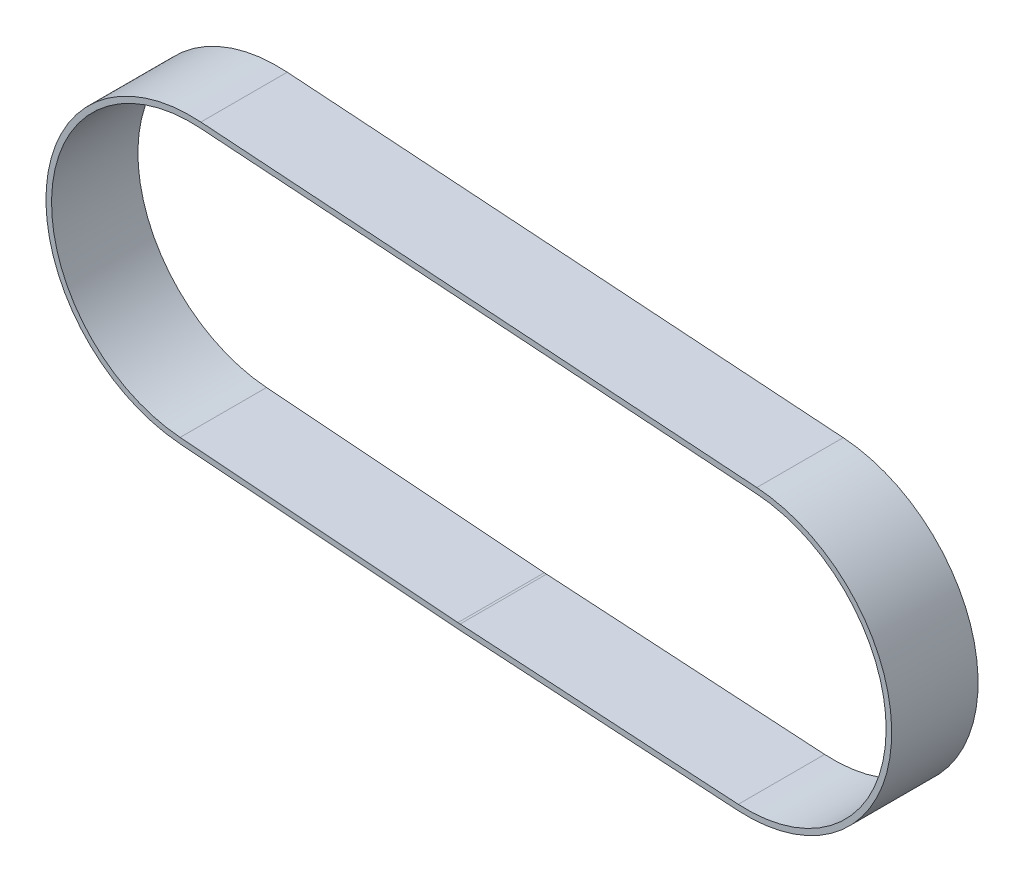
ISO-10303-21;
HEADER;
FILE_DESCRIPTION(('STEP AP214'),'2;1');
FILE_NAME('part.step','',(''),(''),'','','');
FILE_SCHEMA(('AUTOMOTIVE_DESIGN { 1 0 10303 214 1 1 1 1 }'));
ENDSEC;
DATA;
#1=APPLICATION_CONTEXT('core data for automotive mechanical design processes');
#2=APPLICATION_PROTOCOL_DEFINITION('international standard','automotive_design',2000,#1);
#3=PRODUCT_CONTEXT('',#1,'mechanical');
#4=PRODUCT('Part','Part','',(#3));
#5=PRODUCT_RELATED_PRODUCT_CATEGORY('part','',(#4));
#6=PRODUCT_DEFINITION_FORMATION('','',#4);
#7=PRODUCT_DEFINITION_CONTEXT('part definition',#1,'design');
#8=PRODUCT_DEFINITION('design','',#6,#7);
#9=PRODUCT_DEFINITION_SHAPE('','',#8);
#10=(LENGTH_UNIT() NAMED_UNIT(*) SI_UNIT(.MILLI.,.METRE.));
#11=(NAMED_UNIT(*) PLANE_ANGLE_UNIT() SI_UNIT($,.RADIAN.));
#12=(NAMED_UNIT(*) SI_UNIT($,.STERADIAN.) SOLID_ANGLE_UNIT());
#13=UNCERTAINTY_MEASURE_WITH_UNIT(LENGTH_MEASURE(1.E-05),#10,'distance_accuracy_value','');
#14=(GEOMETRIC_REPRESENTATION_CONTEXT(3) GLOBAL_UNCERTAINTY_ASSIGNED_CONTEXT((#13)) GLOBAL_UNIT_ASSIGNED_CONTEXT((#10,
#11,#12)) REPRESENTATION_CONTEXT('',''));
#15=CARTESIAN_POINT('',(0.,0.,0.));
#16=DIRECTION('',(0.,0.,1.));
#17=DIRECTION('',(1.,0.,0.));
#18=AXIS2_PLACEMENT_3D('',#15,#16,#17);
#19=CARTESIAN_POINT('',(0.040774318462956,0.547539602275451,1.));
#20=DIRECTION('',(0.,0.,1.));
#21=DIRECTION('',(1.,0.,0.));
#22=AXIS2_PLACEMENT_3D('',#19,#20,#21);
#23=PLANE('',#22);
#24=CARTESIAN_POINT('',(0.040774318462956,0.547539602275451,1.));
#25=DIRECTION('',(0.,0.,1.));
#26=DIRECTION('',(1.,0.,0.));
#27=AXIS2_PLACEMENT_3D('',#24,#25,#26);
#28=CIRCLE('',#27,52.);
#29=CARTESIAN_POINT('',(3.63482432062209,52.4231871122775,1.));
#30=VERTEX_POINT('',#29);
#31=CARTESIAN_POINT('',(-3.96322801868593,-51.2980770425684,1.));
#32=VERTEX_POINT('',#31);
#33=EDGE_CURVE('E205',#30,#32,#28,.T.);
#34=ORIENTED_EDGE('',*,*,#33,.T.);
#35=DIRECTION('',(0.99703108932392,-0.0770000449451709,0.));
#36=VECTOR('',#35,1.);
#37=CARTESIAN_POINT('',(-3.96322801868593,-51.2980770425684,1.));
#38=LINE('',#37,#36);
#39=CARTESIAN_POINT('',(95.7398809137061,-58.9980815370855,1.));
#40=VERTEX_POINT('',#39);
#41=EDGE_CURVE('E268',#32,#40,#38,.T.);
#42=ORIENTED_EDGE('',*,*,#41,.T.);
#43=CARTESIAN_POINT('',(99.743883250855,-7.15246489224164,1.));
#44=DIRECTION('',(0.,0.,1.));
#45=DIRECTION('',(1.,0.,0.));
#46=AXIS2_PLACEMENT_3D('',#43,#44,#45);
#47=CIRCLE('',#46,52.);
#48=CARTESIAN_POINT('',(96.5600101623259,-59.0549017536853,1.));
#49=VERTEX_POINT('',#48);
#50=EDGE_CURVE('E270',#40,#49,#47,.T.);
#51=ORIENTED_EDGE('',*,*,#50,.T.);
#52=DIRECTION('',(0.998123785796992,-0.0612283286255595,0.));
#53=VECTOR('',#52,1.);
#54=CARTESIAN_POINT('',(96.5600101623259,-59.0549017536853,1.));
#55=LINE('',#54,#53);
#56=CARTESIAN_POINT('',(196.372388742025,-65.1777346162412,1.));
#57=VERTEX_POINT('',#56);
#58=EDGE_CURVE('E272',#49,#57,#55,.T.);
#59=ORIENTED_EDGE('',*,*,#58,.T.);
#60=CARTESIAN_POINT('',(199.556261830554,-13.2752977547976,1.));
#61=DIRECTION('',(0.,0.,1.));
#62=DIRECTION('',(1.,0.,0.));
#63=AXIS2_PLACEMENT_3D('',#60,#61,#62);
#64=CIRCLE('',#63,52.);
#65=CARTESIAN_POINT('',(203.150311832713,38.6003497552045,1.));
#66=VERTEX_POINT('',#65);
#67=EDGE_CURVE('E274',#57,#66,#64,.T.);
#68=ORIENTED_EDGE('',*,*,#67,.T.);
#69=DIRECTION('',(-0.997608605961578,0.0691163461953677,0.));
#70=VECTOR('',#69,1.);
#71=CARTESIAN_POINT('',(203.150311832713,38.6003497552045,1.));
#72=LINE('',#71,#70);
#73=EDGE_CURVE('E128',#66,#30,#72,.T.);
#74=ORIENTED_EDGE('',*,*,#73,.T.);
#75=EDGE_LOOP('',(#34,#42,#51,#59,#68,#74));
#76=FACE_BOUND('',#75,.T.);
#77=DIRECTION('',(0.99703108932392,-0.0770000449451709,0.));
#78=VECTOR('',#77,1.);
#79=CARTESIAN_POINT('',(-3.80922792879559,-49.3040148639205,1.));
#80=LINE('',#79,#78);
#81=CARTESIAN_POINT('',(-3.80922792879559,-49.3040148639205,1.));
#82=VERTEX_POINT('',#81);
#83=CARTESIAN_POINT('',(95.8938810035964,-57.0040193584376,1.));
#84=VERTEX_POINT('',#83);
#85=EDGE_CURVE('E249',#82,#84,#80,.T.);
#86=ORIENTED_EDGE('',*,*,#85,.F.);
#87=CARTESIAN_POINT('',(0.040774318462956,0.547539602275451,1.));
#88=DIRECTION('',(0.,0.,1.));
#89=DIRECTION('',(1.,0.,0.));
#90=AXIS2_PLACEMENT_3D('',#87,#88,#89);
#91=CIRCLE('',#90,50.);
#92=CARTESIAN_POINT('',(3.49659162823134,50.4279699003543,1.));
#93=VERTEX_POINT('',#92);
#94=EDGE_CURVE('E202',#93,#82,#91,.T.);
#95=ORIENTED_EDGE('',*,*,#94,.F.);
#96=DIRECTION('',(-0.997608605961578,0.0691163461953676,0.));
#97=VECTOR('',#96,1.);
#98=CARTESIAN_POINT('',(203.012079140322,36.6051325432813,1.));
#99=LINE('',#98,#97);
#100=CARTESIAN_POINT('',(203.012079140322,36.6051325432813,1.));
#101=VERTEX_POINT('',#100);
#102=EDGE_CURVE('E257',#101,#93,#99,.T.);
#103=ORIENTED_EDGE('',*,*,#102,.F.);
#104=CARTESIAN_POINT('',(199.556261830554,-13.2752977547976,1.));
#105=DIRECTION('',(0.,0.,1.));
#106=DIRECTION('',(1.,0.,0.));
#107=AXIS2_PLACEMENT_3D('',#104,#105,#106);
#108=CIRCLE('',#107,50.);
#109=CARTESIAN_POINT('',(196.494845399276,-63.1814870446472,1.));
#110=VERTEX_POINT('',#109);
#111=EDGE_CURVE('E255',#110,#101,#108,.T.);
#112=ORIENTED_EDGE('',*,*,#111,.F.);
#113=DIRECTION('',(0.998123785796992,-0.0612283286255595,0.));
#114=VECTOR('',#113,1.);
#115=CARTESIAN_POINT('',(96.682466819577,-57.0586541820913,1.));
#116=LINE('',#115,#114);
#117=CARTESIAN_POINT('',(96.682466819577,-57.0586541820913,1.));
#118=VERTEX_POINT('',#117);
#119=EDGE_CURVE('E253',#118,#110,#116,.T.);
#120=ORIENTED_EDGE('',*,*,#119,.F.);
#121=CARTESIAN_POINT('',(99.743883250855,-7.15246489224164,1.));
#122=DIRECTION('',(0.,0.,1.));
#123=DIRECTION('',(1.,0.,0.));
#124=AXIS2_PLACEMENT_3D('',#121,#122,#123);
#125=CIRCLE('',#124,50.);
#126=EDGE_CURVE('E251',#84,#118,#125,.T.);
#127=ORIENTED_EDGE('',*,*,#126,.F.);
#128=EDGE_LOOP('',(#86,#95,#103,#112,#120,#127));
#129=FACE_BOUND('',#128,.T.);
#130=ADVANCED_FACE('F105',(#76,#129),#23,.T.);
#131=CARTESIAN_POINT('',(0.040774318462956,0.547539602275451,1.));
#132=DIRECTION('',(0.,0.,-1.));
#133=DIRECTION('',(-1.,0.,0.));
#134=AXIS2_PLACEMENT_3D('',#131,#132,#133);
#135=CYLINDRICAL_SURFACE('',#134,52.);
#136=DIRECTION('',(0.,0.,-1.));
#137=VECTOR('',#136,1.);
#138=CARTESIAN_POINT('',(3.63482432062209,52.4231871122775,1.));
#139=LINE('',#138,#137);
#140=CARTESIAN_POINT('',(3.63482432062209,52.4231871122775,-30.));
#141=VERTEX_POINT('',#140);
#142=EDGE_CURVE('E277',#30,#141,#139,.T.);
#143=ORIENTED_EDGE('',*,*,#142,.T.);
#144=CARTESIAN_POINT('',(0.040774318462956,0.547539602275451,-30.));
#145=DIRECTION('',(0.,0.,1.));
#146=DIRECTION('',(1.,0.,0.));
#147=AXIS2_PLACEMENT_3D('',#144,#145,#146);
#148=CIRCLE('',#147,52.);
#149=CARTESIAN_POINT('',(-3.96322801868593,-51.2980770425684,-30.));
#150=VERTEX_POINT('',#149);
#151=EDGE_CURVE('E230',#141,#150,#148,.T.);
#152=ORIENTED_EDGE('',*,*,#151,.T.);
#153=DIRECTION('',(0.,0.,-1.));
#154=VECTOR('',#153,1.);
#155=CARTESIAN_POINT('',(-3.96322801868593,-51.2980770425684,1.));
#156=LINE('',#155,#154);
#157=EDGE_CURVE('E12',#32,#150,#156,.T.);
#158=ORIENTED_EDGE('',*,*,#157,.F.);
#159=ORIENTED_EDGE('',*,*,#33,.F.);
#160=EDGE_LOOP('',(#143,#152,#158,#159));
#161=FACE_BOUND('',#160,.T.);
#162=ADVANCED_FACE('F107',(#161),#135,.T.);
#163=CARTESIAN_POINT('',(-3.96322801868593,-51.2980770425684,1.));
#164=DIRECTION('',(0.0770000449451709,0.997031089323919,0.));
#165=DIRECTION('',(-0.99703108932392,0.0770000449451709,0.));
#166=AXIS2_PLACEMENT_3D('',#163,#164,#165);
#167=PLANE('',#166);
#168=ORIENTED_EDGE('',*,*,#157,.T.);
#169=DIRECTION('',(0.99703108932392,-0.0770000449451709,0.));
#170=VECTOR('',#169,1.);
#171=CARTESIAN_POINT('',(-3.96322801868593,-51.2980770425684,-30.));
#172=LINE('',#171,#170);
#173=CARTESIAN_POINT('',(95.7398809137061,-58.9980815370855,-30.));
#174=VERTEX_POINT('',#173);
#175=EDGE_CURVE('E233',#150,#174,#172,.T.);
#176=ORIENTED_EDGE('',*,*,#175,.T.);
#177=DIRECTION('',(0.,0.,-1.));
#178=VECTOR('',#177,1.);
#179=CARTESIAN_POINT('',(95.7398809137061,-58.9980815370855,1.));
#180=LINE('',#179,#178);
#181=EDGE_CURVE('E113',#40,#174,#180,.T.);
#182=ORIENTED_EDGE('',*,*,#181,.F.);
#183=ORIENTED_EDGE('',*,*,#41,.F.);
#184=EDGE_LOOP('',(#168,#176,#182,#183));
#185=FACE_BOUND('',#184,.T.);
#186=ADVANCED_FACE('F295',(#185),#167,.F.);
#187=CARTESIAN_POINT('',(99.743883250855,-7.15246489224164,1.));
#188=DIRECTION('',(0.,0.,-1.));
#189=DIRECTION('',(-1.,0.,0.));
#190=AXIS2_PLACEMENT_3D('',#187,#188,#189);
#191=CYLINDRICAL_SURFACE('',#190,52.);
#192=ORIENTED_EDGE('',*,*,#181,.T.);
#193=CARTESIAN_POINT('',(99.743883250855,-7.15246489224164,-30.));
#194=DIRECTION('',(0.,0.,1.));
#195=DIRECTION('',(1.,0.,0.));
#196=AXIS2_PLACEMENT_3D('',#193,#194,#195);
#197=CIRCLE('',#196,52.);
#198=CARTESIAN_POINT('',(96.5600101623259,-59.0549017536853,-30.));
#199=VERTEX_POINT('',#198);
#200=EDGE_CURVE('E236',#174,#199,#197,.T.);
#201=ORIENTED_EDGE('',*,*,#200,.T.);
#202=DIRECTION('',(0.,0.,-1.));
#203=VECTOR('',#202,1.);
#204=CARTESIAN_POINT('',(96.5600101623259,-59.0549017536853,1.));
#205=LINE('',#204,#203);
#206=EDGE_CURVE('E283',#49,#199,#205,.T.);
#207=ORIENTED_EDGE('',*,*,#206,.F.);
#208=ORIENTED_EDGE('',*,*,#50,.F.);
#209=EDGE_LOOP('',(#192,#201,#207,#208));
#210=FACE_BOUND('',#209,.T.);
#211=ADVANCED_FACE('F288',(#210),#191,.T.);
#212=CARTESIAN_POINT('',(96.5600101623259,-59.0549017536853,1.));
#213=DIRECTION('',(0.0612283286255595,0.998123785796992,0.));
#214=DIRECTION('',(-0.998123785796993,0.0612283286255595,0.));
#215=AXIS2_PLACEMENT_3D('',#212,#213,#214);
#216=PLANE('',#215);
#217=ORIENTED_EDGE('',*,*,#206,.T.);
#218=DIRECTION('',(0.998123785796992,-0.0612283286255595,0.));
#219=VECTOR('',#218,1.);
#220=CARTESIAN_POINT('',(96.5600101623259,-59.0549017536853,-30.));
#221=LINE('',#220,#219);
#222=CARTESIAN_POINT('',(196.372388742025,-65.1777346162412,-30.));
#223=VERTEX_POINT('',#222);
#224=EDGE_CURVE('E239',#199,#223,#221,.T.);
#225=ORIENTED_EDGE('',*,*,#224,.T.);
#226=DIRECTION('',(0.,0.,-1.));
#227=VECTOR('',#226,1.);
#228=CARTESIAN_POINT('',(196.372388742025,-65.1777346162412,1.));
#229=LINE('',#228,#227);
#230=EDGE_CURVE('E281',#57,#223,#229,.T.);
#231=ORIENTED_EDGE('',*,*,#230,.F.);
#232=ORIENTED_EDGE('',*,*,#58,.F.);
#233=EDGE_LOOP('',(#217,#225,#231,#232));
#234=FACE_BOUND('',#233,.T.);
#235=ADVANCED_FACE('F308',(#234),#216,.F.);
#236=CARTESIAN_POINT('',(199.556261830554,-13.2752977547976,1.));
#237=DIRECTION('',(0.,0.,-1.));
#238=DIRECTION('',(-1.,0.,0.));
#239=AXIS2_PLACEMENT_3D('',#236,#237,#238);
#240=CYLINDRICAL_SURFACE('',#239,52.);
#241=ORIENTED_EDGE('',*,*,#230,.T.);
#242=CARTESIAN_POINT('',(199.556261830554,-13.2752977547976,-30.));
#243=DIRECTION('',(0.,0.,1.));
#244=DIRECTION('',(1.,0.,0.));
#245=AXIS2_PLACEMENT_3D('',#242,#243,#244);
#246=CIRCLE('',#245,52.);
#247=CARTESIAN_POINT('',(203.150311832713,38.6003497552045,-30.));
#248=VERTEX_POINT('',#247);
#249=EDGE_CURVE('E242',#223,#248,#246,.T.);
#250=ORIENTED_EDGE('',*,*,#249,.T.);
#251=DIRECTION('',(0.,0.,-1.));
#252=VECTOR('',#251,1.);
#253=CARTESIAN_POINT('',(203.150311832713,38.6003497552045,1.));
#254=LINE('',#253,#252);
#255=EDGE_CURVE('E279',#66,#248,#254,.T.);
#256=ORIENTED_EDGE('',*,*,#255,.F.);
#257=ORIENTED_EDGE('',*,*,#67,.F.);
#258=EDGE_LOOP('',(#241,#250,#256,#257));
#259=FACE_BOUND('',#258,.T.);
#260=ADVANCED_FACE('F305',(#259),#240,.T.);
#261=CARTESIAN_POINT('',(203.150311832713,38.6003497552045,1.));
#262=DIRECTION('',(-0.0691163461953676,-0.997608605961577,0.));
#263=DIRECTION('',(0.997608605961578,-0.0691163461953677,0.));
#264=AXIS2_PLACEMENT_3D('',#261,#262,#263);
#265=PLANE('',#264);
#266=ORIENTED_EDGE('',*,*,#255,.T.);
#267=DIRECTION('',(-0.997608605961578,0.0691163461953677,0.));
#268=VECTOR('',#267,1.);
#269=CARTESIAN_POINT('',(203.150311832713,38.6003497552045,-30.));
#270=LINE('',#269,#268);
#271=EDGE_CURVE('E245',#248,#141,#270,.T.);
#272=ORIENTED_EDGE('',*,*,#271,.T.);
#273=ORIENTED_EDGE('',*,*,#142,.F.);
#274=ORIENTED_EDGE('',*,*,#73,.F.);
#275=EDGE_LOOP('',(#266,#272,#273,#274));
#276=FACE_BOUND('',#275,.T.);
#277=ADVANCED_FACE('F301',(#276),#265,.F.);
#278=CARTESIAN_POINT('',(0.040774318462956,0.547539602275451,1.));
#279=DIRECTION('',(0.,0.,-1.));
#280=DIRECTION('',(-1.,0.,0.));
#281=AXIS2_PLACEMENT_3D('',#278,#279,#280);
#282=CYLINDRICAL_SURFACE('',#281,50.);
#283=DIRECTION('',(0.,0.,-1.));
#284=VECTOR('',#283,1.);
#285=CARTESIAN_POINT('',(-3.80922792879559,-49.3040148639205,1.));
#286=LINE('',#285,#284);
#287=CARTESIAN_POINT('',(-3.80922792879559,-49.3040148639205,-30.));
#288=VERTEX_POINT('',#287);
#289=EDGE_CURVE('E194',#82,#288,#286,.T.);
#290=ORIENTED_EDGE('',*,*,#289,.T.);
#291=CARTESIAN_POINT('',(0.040774318462956,0.547539602275451,-30.));
#292=DIRECTION('',(0.,0.,1.));
#293=DIRECTION('',(1.,0.,0.));
#294=AXIS2_PLACEMENT_3D('',#291,#292,#293);
#295=CIRCLE('',#294,50.);
#296=CARTESIAN_POINT('',(3.49659162823134,50.4279699003543,-30.));
#297=VERTEX_POINT('',#296);
#298=EDGE_CURVE('E199',#297,#288,#295,.T.);
#299=ORIENTED_EDGE('',*,*,#298,.F.);
#300=DIRECTION('',(0.,0.,-1.));
#301=VECTOR('',#300,1.);
#302=CARTESIAN_POINT('',(3.49659162823134,50.4279699003543,1.));
#303=LINE('',#302,#301);
#304=EDGE_CURVE('E259',#93,#297,#303,.T.);
#305=ORIENTED_EDGE('',*,*,#304,.F.);
#306=ORIENTED_EDGE('',*,*,#94,.T.);
#307=EDGE_LOOP('',(#290,#299,#305,#306));
#308=FACE_BOUND('',#307,.T.);
#309=ADVANCED_FACE('F196',(#308),#282,.F.);
#310=CARTESIAN_POINT('',(-3.80922792879559,-49.3040148639205,1.));
#311=DIRECTION('',(0.0770000449451709,0.997031089323919,0.));
#312=DIRECTION('',(-0.99703108932392,0.0770000449451709,0.));
#313=AXIS2_PLACEMENT_3D('',#310,#311,#312);
#314=PLANE('',#313);
#315=DIRECTION('',(0.,0.,-1.));
#316=VECTOR('',#315,1.);
#317=CARTESIAN_POINT('',(95.8938810035964,-57.0040193584376,1.));
#318=LINE('',#317,#316);
#319=CARTESIAN_POINT('',(95.8938810035964,-57.0040193584376,-30.));
#320=VERTEX_POINT('',#319);
#321=EDGE_CURVE('E206',#84,#320,#318,.T.);
#322=ORIENTED_EDGE('',*,*,#321,.T.);
#323=DIRECTION('',(0.99703108932392,-0.0770000449451709,0.));
#324=VECTOR('',#323,1.);
#325=CARTESIAN_POINT('',(-3.80922792879559,-49.3040148639205,-30.));
#326=LINE('',#325,#324);
#327=EDGE_CURVE('E209',#288,#320,#326,.T.);
#328=ORIENTED_EDGE('',*,*,#327,.F.);
#329=ORIENTED_EDGE('',*,*,#289,.F.);
#330=ORIENTED_EDGE('',*,*,#85,.T.);
#331=EDGE_LOOP('',(#322,#328,#329,#330));
#332=FACE_BOUND('',#331,.T.);
#333=ADVANCED_FACE('F210',(#332),#314,.T.);
#334=CARTESIAN_POINT('',(99.743883250855,-7.15246489224164,1.));
#335=DIRECTION('',(0.,0.,-1.));
#336=DIRECTION('',(-1.,0.,0.));
#337=AXIS2_PLACEMENT_3D('',#334,#335,#336);
#338=CYLINDRICAL_SURFACE('',#337,50.);
#339=DIRECTION('',(0.,0.,-1.));
#340=VECTOR('',#339,1.);
#341=CARTESIAN_POINT('',(96.682466819577,-57.0586541820913,1.));
#342=LINE('',#341,#340);
#343=CARTESIAN_POINT('',(96.682466819577,-57.0586541820913,-30.));
#344=VERTEX_POINT('',#343);
#345=EDGE_CURVE('E264',#118,#344,#342,.T.);
#346=ORIENTED_EDGE('',*,*,#345,.T.);
#347=CARTESIAN_POINT('',(99.743883250855,-7.15246489224164,-30.));
#348=DIRECTION('',(0.,0.,1.));
#349=DIRECTION('',(1.,0.,0.));
#350=AXIS2_PLACEMENT_3D('',#347,#348,#349);
#351=CIRCLE('',#350,50.);
#352=EDGE_CURVE('E215',#320,#344,#351,.T.);
#353=ORIENTED_EDGE('',*,*,#352,.F.);
#354=ORIENTED_EDGE('',*,*,#321,.F.);
#355=ORIENTED_EDGE('',*,*,#126,.T.);
#356=EDGE_LOOP('',(#346,#353,#354,#355));
#357=FACE_BOUND('',#356,.T.);
#358=ADVANCED_FACE('F317',(#357),#338,.F.);
#359=CARTESIAN_POINT('',(96.682466819577,-57.0586541820913,1.));
#360=DIRECTION('',(0.0612283286255595,0.998123785796992,0.));
#361=DIRECTION('',(-0.998123785796993,0.0612283286255595,0.));
#362=AXIS2_PLACEMENT_3D('',#359,#360,#361);
#363=PLANE('',#362);
#364=DIRECTION('',(0.,0.,-1.));
#365=VECTOR('',#364,1.);
#366=CARTESIAN_POINT('',(196.494845399276,-63.1814870446472,1.));
#367=LINE('',#366,#365);
#368=CARTESIAN_POINT('',(196.494845399276,-63.1814870446472,-30.));
#369=VERTEX_POINT('',#368);
#370=EDGE_CURVE('E262',#110,#369,#367,.T.);
#371=ORIENTED_EDGE('',*,*,#370,.T.);
#372=DIRECTION('',(0.998123785796992,-0.0612283286255595,0.));
#373=VECTOR('',#372,1.);
#374=CARTESIAN_POINT('',(96.682466819577,-57.0586541820913,-30.));
#375=LINE('',#374,#373);
#376=EDGE_CURVE('E224',#344,#369,#375,.T.);
#377=ORIENTED_EDGE('',*,*,#376,.F.);
#378=ORIENTED_EDGE('',*,*,#345,.F.);
#379=ORIENTED_EDGE('',*,*,#119,.T.);
#380=EDGE_LOOP('',(#371,#377,#378,#379));
#381=FACE_BOUND('',#380,.T.);
#382=ADVANCED_FACE('F322',(#381),#363,.T.);
#383=CARTESIAN_POINT('',(199.556261830554,-13.2752977547976,1.));
#384=DIRECTION('',(0.,0.,-1.));
#385=DIRECTION('',(-1.,0.,0.));
#386=AXIS2_PLACEMENT_3D('',#383,#384,#385);
#387=CYLINDRICAL_SURFACE('',#386,50.);
#388=DIRECTION('',(0.,0.,-1.));
#389=VECTOR('',#388,1.);
#390=CARTESIAN_POINT('',(203.012079140322,36.6051325432813,1.));
#391=LINE('',#390,#389);
#392=CARTESIAN_POINT('',(203.012079140322,36.6051325432813,-30.));
#393=VERTEX_POINT('',#392);
#394=EDGE_CURVE('E120',#101,#393,#391,.T.);
#395=ORIENTED_EDGE('',*,*,#394,.T.);
#396=CARTESIAN_POINT('',(199.556261830554,-13.2752977547976,-30.));
#397=DIRECTION('',(0.,0.,1.));
#398=DIRECTION('',(1.,0.,0.));
#399=AXIS2_PLACEMENT_3D('',#396,#397,#398);
#400=CIRCLE('',#399,50.);
#401=EDGE_CURVE('E227',#369,#393,#400,.T.);
#402=ORIENTED_EDGE('',*,*,#401,.F.);
#403=ORIENTED_EDGE('',*,*,#370,.F.);
#404=ORIENTED_EDGE('',*,*,#111,.T.);
#405=EDGE_LOOP('',(#395,#402,#403,#404));
#406=FACE_BOUND('',#405,.T.);
#407=ADVANCED_FACE('F326',(#406),#387,.F.);
#408=CARTESIAN_POINT('',(203.012079140322,36.6051325432813,1.));
#409=DIRECTION('',(-0.0691163461953676,-0.997608605961577,0.));
#410=DIRECTION('',(0.997608605961578,-0.0691163461953676,0.));
#411=AXIS2_PLACEMENT_3D('',#408,#409,#410);
#412=PLANE('',#411);
#413=ORIENTED_EDGE('',*,*,#304,.T.);
#414=DIRECTION('',(-0.997608605961578,0.0691163461953676,0.));
#415=VECTOR('',#414,1.);
#416=CARTESIAN_POINT('',(203.012079140322,36.6051325432813,-30.));
#417=LINE('',#416,#415);
#418=EDGE_CURVE('E220',#393,#297,#417,.T.);
#419=ORIENTED_EDGE('',*,*,#418,.F.);
#420=ORIENTED_EDGE('',*,*,#394,.F.);
#421=ORIENTED_EDGE('',*,*,#102,.T.);
#422=EDGE_LOOP('',(#413,#419,#420,#421));
#423=FACE_BOUND('',#422,.T.);
#424=ADVANCED_FACE('F327',(#423),#412,.T.);
#425=CARTESIAN_POINT('',(0.040774318462956,0.547539602275451,-30.));
#426=DIRECTION('',(0.,0.,1.));
#427=DIRECTION('',(1.,0.,0.));
#428=AXIS2_PLACEMENT_3D('',#425,#426,#427);
#429=PLANE('',#428);
#430=ORIENTED_EDGE('',*,*,#418,.T.);
#431=ORIENTED_EDGE('',*,*,#298,.T.);
#432=ORIENTED_EDGE('',*,*,#327,.T.);
#433=ORIENTED_EDGE('',*,*,#352,.T.);
#434=ORIENTED_EDGE('',*,*,#376,.T.);
#435=ORIENTED_EDGE('',*,*,#401,.T.);
#436=EDGE_LOOP('',(#430,#431,#432,#433,#434,#435));
#437=FACE_BOUND('',#436,.T.);
#438=ORIENTED_EDGE('',*,*,#151,.F.);
#439=ORIENTED_EDGE('',*,*,#271,.F.);
#440=ORIENTED_EDGE('',*,*,#249,.F.);
#441=ORIENTED_EDGE('',*,*,#224,.F.);
#442=ORIENTED_EDGE('',*,*,#200,.F.);
#443=ORIENTED_EDGE('',*,*,#175,.F.);
#444=EDGE_LOOP('',(#438,#439,#440,#441,#442,#443));
#445=FACE_BOUND('',#444,.T.);
#446=ADVANCED_FACE('F217',(#437,#445),#429,.F.);
#447=CLOSED_SHELL('',(#130,#162,#186,#211,#235,#260,#277,#309,#333,#358,#382,#407,#424,#446));
#448=MANIFOLD_SOLID_BREP('B2',#447);
#449=ADVANCED_BREP_SHAPE_REPRESENTATION('',(#18,#448),#14);
#450=SHAPE_DEFINITION_REPRESENTATION(#9,#449);
ENDSEC;
END-ISO-10303-21;
